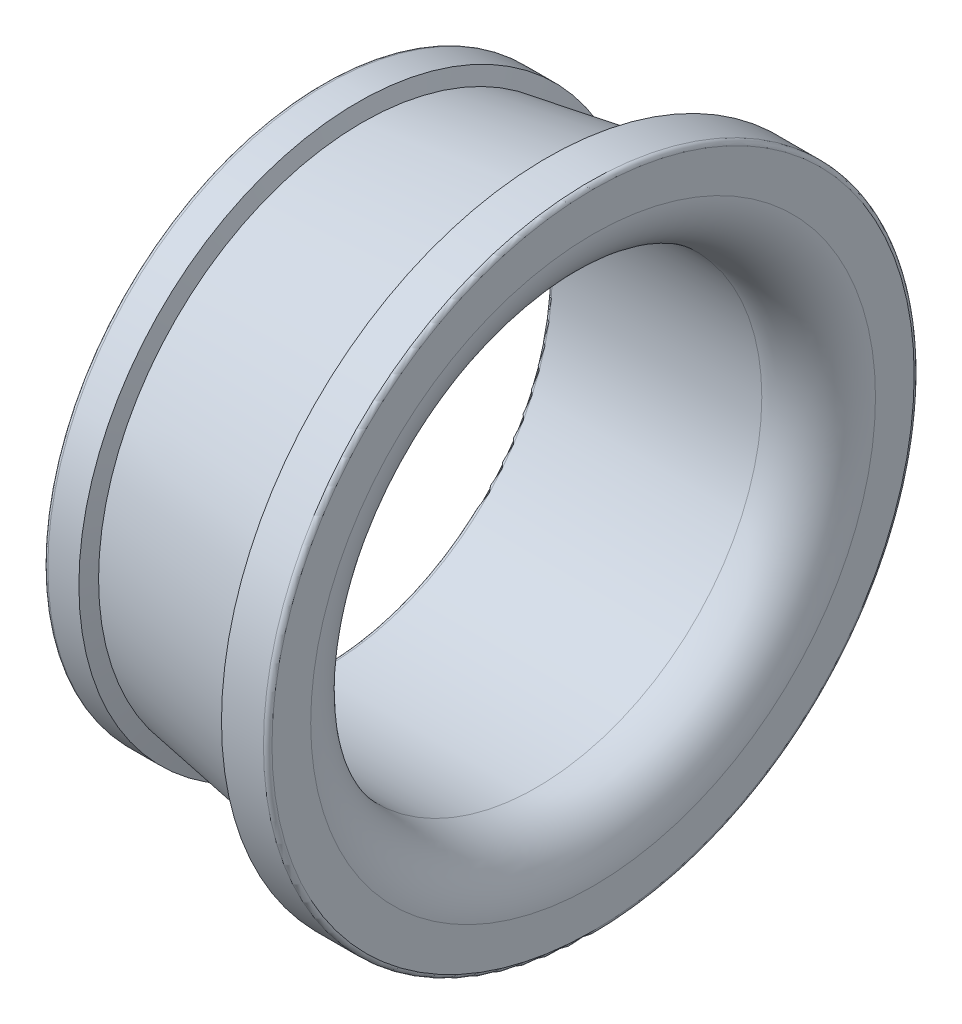
ISO-10303-21;
HEADER;
FILE_DESCRIPTION(('STEP AP214'),'2;1');
FILE_NAME('part.step','',(''),(''),'','','');
FILE_SCHEMA(('AUTOMOTIVE_DESIGN { 1 0 10303 214 1 1 1 1 }'));
ENDSEC;
DATA;
#1=APPLICATION_CONTEXT('core data for automotive mechanical design processes');
#2=APPLICATION_PROTOCOL_DEFINITION('international standard','automotive_design',2000,#1);
#3=PRODUCT_CONTEXT('',#1,'mechanical');
#4=PRODUCT('Part','Part','',(#3));
#5=PRODUCT_RELATED_PRODUCT_CATEGORY('part','',(#4));
#6=PRODUCT_DEFINITION_FORMATION('','',#4);
#7=PRODUCT_DEFINITION_CONTEXT('part definition',#1,'design');
#8=PRODUCT_DEFINITION('design','',#6,#7);
#9=PRODUCT_DEFINITION_SHAPE('','',#8);
#10=(LENGTH_UNIT() NAMED_UNIT(*) SI_UNIT(.MILLI.,.METRE.));
#11=(NAMED_UNIT(*) PLANE_ANGLE_UNIT() SI_UNIT($,.RADIAN.));
#12=(NAMED_UNIT(*) SI_UNIT($,.STERADIAN.) SOLID_ANGLE_UNIT());
#13=UNCERTAINTY_MEASURE_WITH_UNIT(LENGTH_MEASURE(1.E-05),#10,'distance_accuracy_value','');
#14=(GEOMETRIC_REPRESENTATION_CONTEXT(3) GLOBAL_UNCERTAINTY_ASSIGNED_CONTEXT((#13)) GLOBAL_UNIT_ASSIGNED_CONTEXT((#10,
#11,#12)) REPRESENTATION_CONTEXT('',''));
#15=CARTESIAN_POINT('',(0.,0.,0.));
#16=DIRECTION('',(0.,0.,1.));
#17=DIRECTION('',(1.,0.,0.));
#18=AXIS2_PLACEMENT_3D('',#15,#16,#17);
#19=CARTESIAN_POINT('',(14.1609999999992,-2.22044604925031E-13,2.22044604925031E-13));
#20=DIRECTION('',(-1.,0.,0.));
#21=DIRECTION('',(0.,0.,1.));
#22=AXIS2_PLACEMENT_3D('',#19,#20,#21);
#23=TOROIDAL_SURFACE('',#22,19.8750000000008,4.00000000000065);
#24=CARTESIAN_POINT('',(18.1609999999999,-2.19495305138409E-13,2.19668903949082E-13));
#25=DIRECTION('',(1.,0.,0.));
#26=DIRECTION('',(0.,0.,1.));
#27=AXIS2_PLACEMENT_3D('',#24,#25,#26);
#28=CIRCLE('',#27,19.8750000000006);
#29=CARTESIAN_POINT('',(18.1609999999995,0.,19.8750000000002));
#30=VERTEX_POINT('',#29);
#31=CARTESIAN_POINT('',(18.1609999999999,4.44089209850063E-13,-19.8750000000006));
#32=VERTEX_POINT('',#31);
#33=EDGE_CURVE('E61',#30,#32,#28,.T.);
#34=ORIENTED_EDGE('',*,*,#33,.T.);
#35=CARTESIAN_POINT('',(18.1609999999999,-2.19495305138409E-13,2.19668903949082E-13));
#36=DIRECTION('',(1.,0.,0.));
#37=DIRECTION('',(0.,0.,-1.));
#38=AXIS2_PLACEMENT_3D('',#35,#36,#37);
#39=CIRCLE('',#38,19.8750000000006);
#40=EDGE_CURVE('E58',#32,#30,#39,.T.);
#41=ORIENTED_EDGE('',*,*,#40,.T.);
#42=EDGE_LOOP('',(#34,#41));
#43=FACE_BOUND('',#42,.T.);
#44=CARTESIAN_POINT('',(14.1609999999994,0.,1.11022302462516E-13));
#45=DIRECTION('',(-1.,0.,0.));
#46=DIRECTION('',(0.,0.,1.));
#47=AXIS2_PLACEMENT_3D('',#44,#45,#46);
#48=CIRCLE('',#47,15.875);
#49=CARTESIAN_POINT('',(14.1609999999994,0.,15.8750000000001));
#50=VERTEX_POINT('',#49);
#51=EDGE_CURVE('E109',#50,#50,#48,.T.);
#52=ORIENTED_EDGE('',*,*,#51,.T.);
#53=EDGE_LOOP('',(#52));
#54=FACE_BOUND('',#53,.T.);
#55=ADVANCED_FACE('F17',(#43,#54),#23,.T.);
#56=CARTESIAN_POINT('',(18.1609999999998,19.8750000000003,-4.44089209850063E-13));
#57=DIRECTION('',(-1.,0.,0.));
#58=DIRECTION('',(0.,0.,1.));
#59=AXIS2_PLACEMENT_3D('',#56,#57,#58);
#60=PLANE('',#59);
#61=ORIENTED_EDGE('',*,*,#33,.F.);
#62=ORIENTED_EDGE('',*,*,#40,.F.);
#63=EDGE_LOOP('',(#61,#62));
#64=FACE_BOUND('',#63,.T.);
#65=CARTESIAN_POINT('',(18.1609999999997,0.,4.43911032276867E-13));
#66=DIRECTION('',(-1.,0.,0.));
#67=DIRECTION('',(0.,0.,-1.));
#68=AXIS2_PLACEMENT_3D('',#65,#66,#67);
#69=CIRCLE('',#68,22.5999999999993);
#70=CARTESIAN_POINT('',(18.1609999999996,0.,-22.5999999999996));
#71=VERTEX_POINT('',#70);
#72=CARTESIAN_POINT('',(18.1609999999996,0.,22.5999999999998));
#73=VERTEX_POINT('',#72);
#74=EDGE_CURVE('E69',#71,#73,#69,.T.);
#75=ORIENTED_EDGE('',*,*,#74,.F.);
#76=CARTESIAN_POINT('',(18.1609999999997,0.,4.43911032276867E-13));
#77=DIRECTION('',(-1.,0.,0.));
#78=DIRECTION('',(0.,0.,1.));
#79=AXIS2_PLACEMENT_3D('',#76,#77,#78);
#80=CIRCLE('',#79,22.5999999999993);
#81=EDGE_CURVE('E105',#73,#71,#80,.T.);
#82=ORIENTED_EDGE('',*,*,#81,.F.);
#83=EDGE_LOOP('',(#75,#82));
#84=FACE_BOUND('',#83,.T.);
#85=ADVANCED_FACE('F67',(#64,#84),#60,.F.);
#86=CARTESIAN_POINT('',(18.1609999999999,4.44089209850063E-13,-4.44089209850063E-13));
#87=DIRECTION('',(-1.,0.,0.));
#88=DIRECTION('',(0.,0.,1.));
#89=AXIS2_PLACEMENT_3D('',#86,#87,#88);
#90=CYLINDRICAL_SURFACE('',#89,15.875);
#91=ORIENTED_EDGE('',*,*,#51,.F.);
#92=EDGE_LOOP('',(#91));
#93=FACE_BOUND('',#92,.T.);
#94=CARTESIAN_POINT('',(-0.588999999999951,0.,0.));
#95=DIRECTION('',(-1.,0.,0.));
#96=DIRECTION('',(0.,0.,1.));
#97=AXIS2_PLACEMENT_3D('',#94,#95,#96);
#98=CIRCLE('',#97,15.875);
#99=CARTESIAN_POINT('',(-0.588999999999957,0.,15.875));
#100=VERTEX_POINT('',#99);
#101=EDGE_CURVE('E108',#100,#100,#98,.F.);
#102=ORIENTED_EDGE('',*,*,#101,.F.);
#103=EDGE_LOOP('',(#102));
#104=FACE_BOUND('',#103,.T.);
#105=ADVANCED_FACE('F87',(#93,#104),#90,.F.);
#106=CARTESIAN_POINT('',(17.8609999999998,0.,4.44089209850063E-13));
#107=DIRECTION('',(-1.,0.,0.));
#108=DIRECTION('',(0.,0.,1.));
#109=AXIS2_PLACEMENT_3D('',#106,#107,#108);
#110=TOROIDAL_SURFACE('',#109,22.5999999999994,0.29999999999988);
#111=CARTESIAN_POINT('',(17.8610000000001,0.,1.11022302462516E-13));
#112=DIRECTION('',(-1.,0.,0.));
#113=DIRECTION('',(0.,0.,1.));
#114=AXIS2_PLACEMENT_3D('',#111,#112,#113);
#115=CIRCLE('',#114,22.9);
#116=CARTESIAN_POINT('',(17.8610000000001,0.,22.9000000000001));
#117=VERTEX_POINT('',#116);
#118=EDGE_CURVE('E140',#117,#117,#115,.T.);
#119=ORIENTED_EDGE('',*,*,#118,.F.);
#120=EDGE_LOOP('',(#119));
#121=FACE_BOUND('',#120,.T.);
#122=ORIENTED_EDGE('',*,*,#81,.T.);
#123=ORIENTED_EDGE('',*,*,#74,.T.);
#124=EDGE_LOOP('',(#122,#123));
#125=FACE_BOUND('',#124,.T.);
#126=ADVANCED_FACE('F111',(#121,#125),#110,.T.);
#127=CARTESIAN_POINT('',(-0.589000000000293,0.,0.));
#128=DIRECTION('',(-1.,0.,0.));
#129=DIRECTION('',(0.,0.,1.));
#130=AXIS2_PLACEMENT_3D('',#127,#128,#129);
#131=TOROIDAL_SURFACE('',#130,16.1750000000002,0.299999999999946);
#132=ORIENTED_EDGE('',*,*,#101,.T.);
#133=EDGE_LOOP('',(#132));
#134=FACE_BOUND('',#133,.T.);
#135=CARTESIAN_POINT('',(-0.889000000000241,0.,0.));
#136=DIRECTION('',(-1.,0.,0.));
#137=DIRECTION('',(0.,0.,1.));
#138=AXIS2_PLACEMENT_3D('',#135,#136,#137);
#139=CIRCLE('',#138,16.1750000000002);
#140=CARTESIAN_POINT('',(-0.889000000000362,0.,16.1749999999996));
#141=VERTEX_POINT('',#140);
#142=CARTESIAN_POINT('',(-0.889000000000473,4.44089209850063E-13,-16.1750000000002));
#143=VERTEX_POINT('',#142);
#144=EDGE_CURVE('E148',#141,#143,#139,.T.);
#145=ORIENTED_EDGE('',*,*,#144,.T.);
#146=CARTESIAN_POINT('',(-0.889000000000242,0.,0.));
#147=DIRECTION('',(-1.,0.,0.));
#148=DIRECTION('',(0.,0.,-1.));
#149=AXIS2_PLACEMENT_3D('',#146,#147,#148);
#150=CIRCLE('',#149,16.1750000000002);
#151=EDGE_CURVE('E144',#143,#141,#150,.T.);
#152=ORIENTED_EDGE('',*,*,#151,.T.);
#153=EDGE_LOOP('',(#145,#152));
#154=FACE_BOUND('',#153,.T.);
#155=ADVANCED_FACE('F127',(#134,#154),#131,.T.);
#156=CARTESIAN_POINT('',(18.1609999999999,4.44089209850063E-13,-4.44089209850063E-13));
#157=DIRECTION('',(-1.,0.,0.));
#158=DIRECTION('',(0.,0.,1.));
#159=AXIS2_PLACEMENT_3D('',#156,#157,#158);
#160=CYLINDRICAL_SURFACE('',#159,22.9);
#161=CARTESIAN_POINT('',(14.907,4.44089209850063E-13,3.33066907387547E-13));
#162=DIRECTION('',(-1.,0.,0.));
#163=DIRECTION('',(0.,0.,1.));
#164=AXIS2_PLACEMENT_3D('',#161,#162,#163);
#165=CIRCLE('',#164,22.9);
#166=CARTESIAN_POINT('',(14.907,4.26292334765321E-13,22.9000000000003));
#167=VERTEX_POINT('',#166);
#168=EDGE_CURVE('E158',#167,#167,#165,.F.);
#169=ORIENTED_EDGE('',*,*,#168,.T.);
#170=EDGE_LOOP('',(#169));
#171=FACE_BOUND('',#170,.T.);
#172=ORIENTED_EDGE('',*,*,#118,.T.);
#173=EDGE_LOOP('',(#172));
#174=FACE_BOUND('',#173,.T.);
#175=ADVANCED_FACE('F177',(#171,#174),#160,.T.);
#176=CARTESIAN_POINT('',(-0.889000000000251,19.3270000000003,-4.44089209850063E-13));
#177=DIRECTION('',(1.,0.,0.));
#178=DIRECTION('',(0.,0.,-1.));
#179=AXIS2_PLACEMENT_3D('',#176,#177,#178);
#180=PLANE('',#179);
#181=CARTESIAN_POINT('',(-0.889000000000016,0.,0.));
#182=DIRECTION('',(1.,0.,0.));
#183=DIRECTION('',(0.,0.,1.));
#184=AXIS2_PLACEMENT_3D('',#181,#182,#183);
#185=CIRCLE('',#184,19.3269999999996);
#186=CARTESIAN_POINT('',(-0.889000000000362,0.,19.3269999999997));
#187=VERTEX_POINT('',#186);
#188=CARTESIAN_POINT('',(-0.889000000000473,0.,-19.327));
#189=VERTEX_POINT('',#188);
#190=EDGE_CURVE('E37',#187,#189,#185,.T.);
#191=ORIENTED_EDGE('',*,*,#190,.F.);
#192=CARTESIAN_POINT('',(-0.889000000000017,0.,0.));
#193=DIRECTION('',(1.,0.,0.));
#194=DIRECTION('',(0.,0.,-1.));
#195=AXIS2_PLACEMENT_3D('',#192,#193,#194);
#196=CIRCLE('',#195,19.3269999999996);
#197=EDGE_CURVE('E194',#189,#187,#196,.T.);
#198=ORIENTED_EDGE('',*,*,#197,.F.);
#199=EDGE_LOOP('',(#191,#198));
#200=FACE_BOUND('',#199,.T.);
#201=ORIENTED_EDGE('',*,*,#151,.F.);
#202=ORIENTED_EDGE('',*,*,#144,.F.);
#203=EDGE_LOOP('',(#201,#202));
#204=FACE_BOUND('',#203,.T.);
#205=ADVANCED_FACE('F160',(#200,#204),#180,.F.);
#206=CARTESIAN_POINT('',(14.907,4.44089209850063E-13,3.33066907387547E-13));
#207=DIRECTION('',(-1.,0.,0.));
#208=DIRECTION('',(0.,-1.,0.));
#209=AXIS2_PLACEMENT_3D('',#206,#207,#208);
#210=CONICAL_SURFACE('',#209,22.9,1.41955252823784);
#211=CARTESIAN_POINT('',(15.2103998227088,0.,-3.33066907387547E-13));
#212=DIRECTION('',(-1.,0.,0.));
#213=DIRECTION('',(0.,0.,1.));
#214=AXIS2_PLACEMENT_3D('',#211,#212,#213);
#215=CIRCLE('',#214,20.909287666333);
#216=CARTESIAN_POINT('',(15.2103998227088,0.,20.9092876663327));
#217=VERTEX_POINT('',#216);
#218=EDGE_CURVE('E220',#217,#217,#215,.F.);
#219=ORIENTED_EDGE('',*,*,#218,.T.);
#220=EDGE_LOOP('',(#219));
#221=FACE_BOUND('',#220,.T.);
#222=ORIENTED_EDGE('',*,*,#168,.F.);
#223=EDGE_LOOP('',(#222));
#224=FACE_BOUND('',#223,.T.);
#225=ADVANCED_FACE('F176',(#221,#224),#210,.F.);
#226=CARTESIAN_POINT('',(-0.589000000000073,0.,0.));
#227=DIRECTION('',(-1.,0.,0.));
#228=DIRECTION('',(0.,0.,1.));
#229=AXIS2_PLACEMENT_3D('',#226,#227,#228);
#230=TOROIDAL_SURFACE('',#229,19.3269999999997,0.299999999999942);
#231=ORIENTED_EDGE('',*,*,#190,.T.);
#232=ORIENTED_EDGE('',*,*,#197,.T.);
#233=EDGE_LOOP('',(#231,#232));
#234=FACE_BOUND('',#233,.T.);
#235=CARTESIAN_POINT('',(-0.588999999999951,0.,0.));
#236=DIRECTION('',(-1.,0.,0.));
#237=DIRECTION('',(0.,0.,1.));
#238=AXIS2_PLACEMENT_3D('',#235,#236,#237);
#239=CIRCLE('',#238,19.627);
#240=CARTESIAN_POINT('',(-0.588999999999958,0.,19.627));
#241=VERTEX_POINT('',#240);
#242=EDGE_CURVE('E150',#241,#241,#239,.F.);
#243=ORIENTED_EDGE('',*,*,#242,.F.);
#244=EDGE_LOOP('',(#243));
#245=FACE_BOUND('',#244,.T.);
#246=ADVANCED_FACE('F206',(#234,#245),#230,.T.);
#247=CARTESIAN_POINT('',(18.1609999999999,4.44089209850063E-13,-4.44089209850063E-13));
#248=DIRECTION('',(-1.,0.,0.));
#249=DIRECTION('',(0.,0.,1.));
#250=AXIS2_PLACEMENT_3D('',#247,#248,#249);
#251=CYLINDRICAL_SURFACE('',#250,19.627);
#252=ORIENTED_EDGE('',*,*,#242,.T.);
#253=EDGE_LOOP('',(#252));
#254=FACE_BOUND('',#253,.T.);
#255=CARTESIAN_POINT('',(1.59700000000029,4.44089209850063E-13,-4.44089209850063E-13));
#256=DIRECTION('',(-1.,0.,0.));
#257=DIRECTION('',(0.,0.,1.));
#258=AXIS2_PLACEMENT_3D('',#255,#256,#257);
#259=CIRCLE('',#258,19.627);
#260=CARTESIAN_POINT('',(1.59700000000029,4.2883596673704E-13,19.6269999999996));
#261=VERTEX_POINT('',#260);
#262=EDGE_CURVE('E223',#261,#261,#259,.F.);
#263=ORIENTED_EDGE('',*,*,#262,.F.);
#264=EDGE_LOOP('',(#263));
#265=FACE_BOUND('',#264,.T.);
#266=ADVANCED_FACE('F215',(#254,#265),#251,.T.);
#267=CARTESIAN_POINT('',(1.59700000000029,4.44089209850063E-13,-4.44089209850063E-13));
#268=DIRECTION('',(-1.,0.,0.));
#269=DIRECTION('',(0.,-1.,0.));
#270=AXIS2_PLACEMENT_3D('',#267,#268,#269);
#271=CONICAL_SURFACE('',#270,19.627,1.28251794271175);
#272=ORIENTED_EDGE('',*,*,#262,.T.);
#273=EDGE_LOOP('',(#272));
#274=FACE_BOUND('',#273,.T.);
#275=CARTESIAN_POINT('',(1.91399999999975,4.44089209850063E-13,4.44089209850063E-13));
#276=DIRECTION('',(1.,0.,0.));
#277=DIRECTION('',(0.,0.,-1.));
#278=AXIS2_PLACEMENT_3D('',#275,#276,#277);
#279=CIRCLE('',#278,18.558);
#280=CARTESIAN_POINT('',(1.91399999999975,4.61602200907407E-13,-18.5579999999996));
#281=VERTEX_POINT('',#280);
#282=EDGE_CURVE('E29',#281,#281,#279,.T.);
#283=ORIENTED_EDGE('',*,*,#282,.F.);
#284=EDGE_LOOP('',(#283));
#285=FACE_BOUND('',#284,.T.);
#286=ADVANCED_FACE('F233',(#274,#285),#271,.T.);
#287=CARTESIAN_POINT('',(15.2329999999996,8.88178419700125E-13,0.));
#288=DIRECTION('',(-1.,0.,0.));
#289=DIRECTION('',(0.,0.,1.));
#290=AXIS2_PLACEMENT_3D('',#287,#288,#289);
#291=TOROIDAL_SURFACE('',#290,20.7610000000005,0.150000000000052);
#292=ORIENTED_EDGE('',*,*,#218,.F.);
#293=EDGE_LOOP('',(#292));
#294=FACE_BOUND('',#293,.T.);
#295=CARTESIAN_POINT('',(15.0850106929239,0.,1.11022302462516E-13));
#296=DIRECTION('',(1.,0.,0.));
#297=DIRECTION('',(0.,0.,-1.));
#298=AXIS2_PLACEMENT_3D('',#295,#296,#297);
#299=CIRCLE('',#298,20.736522153053);
#300=CARTESIAN_POINT('',(15.0850106929239,0.,-20.7365221530529));
#301=VERTEX_POINT('',#300);
#302=EDGE_CURVE('E11',#301,#301,#299,.F.);
#303=ORIENTED_EDGE('',*,*,#302,.F.);
#304=EDGE_LOOP('',(#303));
#305=FACE_BOUND('',#304,.T.);
#306=ADVANCED_FACE('F229',(#294,#305),#291,.F.);
#307=CARTESIAN_POINT('',(15.0850106929239,0.,1.11022302462516E-13));
#308=DIRECTION('',(1.,0.,0.));
#309=DIRECTION('',(0.,0.,-1.));
#310=AXIS2_PLACEMENT_3D('',#307,#308,#309);
#311=CONICAL_SURFACE('',#310,20.736522153053,0.163918725649839);
#312=ORIENTED_EDGE('',*,*,#302,.T.);
#313=EDGE_LOOP('',(#312));
#314=FACE_BOUND('',#313,.T.);
#315=ORIENTED_EDGE('',*,*,#282,.T.);
#316=EDGE_LOOP('',(#315));
#317=FACE_BOUND('',#316,.T.);
#318=ADVANCED_FACE('F232',(#314,#317),#311,.T.);
#319=CLOSED_SHELL('',(#55,#85,#105,#126,#155,#175,#205,#225,#246,#266,#286,#306,#318));
#320=MANIFOLD_SOLID_BREP('B1',#319);
#321=ADVANCED_BREP_SHAPE_REPRESENTATION('',(#18,#320),#14);
#322=SHAPE_DEFINITION_REPRESENTATION(#9,#321);
ENDSEC;
END-ISO-10303-21;
